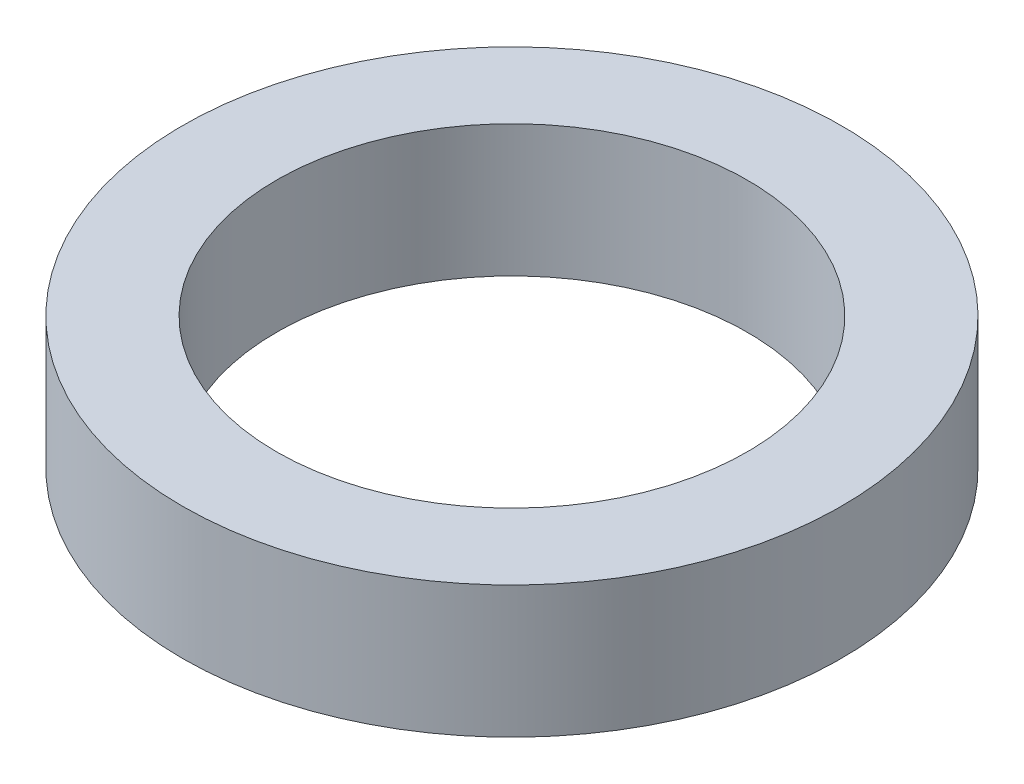
ISO-10303-21;
HEADER;
FILE_DESCRIPTION(('STEP AP214'),'2;1');
FILE_NAME('part.step','',(''),(''),'','','');
FILE_SCHEMA(('AUTOMOTIVE_DESIGN { 1 0 10303 214 1 1 1 1 }'));
ENDSEC;
DATA;
#1=APPLICATION_CONTEXT('core data for automotive mechanical design processes');
#2=APPLICATION_PROTOCOL_DEFINITION('international standard','automotive_design',2000,#1);
#3=PRODUCT_CONTEXT('',#1,'mechanical');
#4=PRODUCT('Part','Part','',(#3));
#5=PRODUCT_RELATED_PRODUCT_CATEGORY('part','',(#4));
#6=PRODUCT_DEFINITION_FORMATION('','',#4);
#7=PRODUCT_DEFINITION_CONTEXT('part definition',#1,'design');
#8=PRODUCT_DEFINITION('design','',#6,#7);
#9=PRODUCT_DEFINITION_SHAPE('','',#8);
#10=(LENGTH_UNIT() NAMED_UNIT(*) SI_UNIT(.MILLI.,.METRE.));
#11=(NAMED_UNIT(*) PLANE_ANGLE_UNIT() SI_UNIT($,.RADIAN.));
#12=(NAMED_UNIT(*) SI_UNIT($,.STERADIAN.) SOLID_ANGLE_UNIT());
#13=UNCERTAINTY_MEASURE_WITH_UNIT(LENGTH_MEASURE(1.E-05),#10,'distance_accuracy_value','');
#14=(GEOMETRIC_REPRESENTATION_CONTEXT(3) GLOBAL_UNCERTAINTY_ASSIGNED_CONTEXT((#13)) GLOBAL_UNIT_ASSIGNED_CONTEXT((#10,
#11,#12)) REPRESENTATION_CONTEXT('',''));
#15=CARTESIAN_POINT('',(0.,0.,0.));
#16=DIRECTION('',(0.,0.,1.));
#17=DIRECTION('',(1.,0.,0.));
#18=AXIS2_PLACEMENT_3D('',#15,#16,#17);
#19=CARTESIAN_POINT('',(0.,14.,0.));
#20=DIRECTION('',(0.,1.,0.));
#21=DIRECTION('',(0.,0.,1.));
#22=AXIS2_PLACEMENT_3D('',#19,#20,#21);
#23=PLANE('',#22);
#24=CARTESIAN_POINT('',(0.,14.,0.));
#25=DIRECTION('',(0.,1.,0.));
#26=DIRECTION('',(0.,0.,1.));
#27=AXIS2_PLACEMENT_3D('',#24,#25,#26);
#28=CIRCLE('',#27,35.);
#29=CARTESIAN_POINT('',(0.,14.,35.));
#30=VERTEX_POINT('',#29);
#31=EDGE_CURVE('E10',#30,#30,#28,.T.);
#32=ORIENTED_EDGE('',*,*,#31,.T.);
#33=EDGE_LOOP('',(#32));
#34=FACE_BOUND('',#33,.T.);
#35=CARTESIAN_POINT('',(0.,14.,0.));
#36=DIRECTION('',(0.,1.,0.));
#37=DIRECTION('',(0.,0.,1.));
#38=AXIS2_PLACEMENT_3D('',#35,#36,#37);
#39=CIRCLE('',#38,25.);
#40=CARTESIAN_POINT('',(0.,14.,25.));
#41=VERTEX_POINT('',#40);
#42=EDGE_CURVE('E54',#41,#41,#39,.T.);
#43=ORIENTED_EDGE('',*,*,#42,.F.);
#44=EDGE_LOOP('',(#43));
#45=FACE_BOUND('',#44,.T.);
#46=ADVANCED_FACE('F41',(#34,#45),#23,.T.);
#47=CARTESIAN_POINT('',(0.,0.,0.));
#48=DIRECTION('',(0.,1.,0.));
#49=DIRECTION('',(0.,0.,1.));
#50=AXIS2_PLACEMENT_3D('',#47,#48,#49);
#51=PLANE('',#50);
#52=CARTESIAN_POINT('',(0.,0.,0.));
#53=DIRECTION('',(0.,1.,0.));
#54=DIRECTION('',(0.,0.,1.));
#55=AXIS2_PLACEMENT_3D('',#52,#53,#54);
#56=CIRCLE('',#55,35.);
#57=CARTESIAN_POINT('',(0.,0.,35.));
#58=VERTEX_POINT('',#57);
#59=EDGE_CURVE('E45',#58,#58,#56,.T.);
#60=ORIENTED_EDGE('',*,*,#59,.F.);
#61=EDGE_LOOP('',(#60));
#62=FACE_BOUND('',#61,.T.);
#63=CARTESIAN_POINT('',(0.,0.,0.));
#64=DIRECTION('',(0.,1.,0.));
#65=DIRECTION('',(0.,0.,1.));
#66=AXIS2_PLACEMENT_3D('',#63,#64,#65);
#67=CIRCLE('',#66,25.);
#68=CARTESIAN_POINT('',(0.,0.,25.));
#69=VERTEX_POINT('',#68);
#70=EDGE_CURVE('E56',#69,#69,#67,.T.);
#71=ORIENTED_EDGE('',*,*,#70,.T.);
#72=EDGE_LOOP('',(#71));
#73=FACE_BOUND('',#72,.T.);
#74=ADVANCED_FACE('F68',(#62,#73),#51,.F.);
#75=CARTESIAN_POINT('',(0.,14.,0.));
#76=DIRECTION('',(0.,-1.,0.));
#77=DIRECTION('',(0.,0.,-1.));
#78=AXIS2_PLACEMENT_3D('',#75,#76,#77);
#79=CYLINDRICAL_SURFACE('',#78,35.);
#80=ORIENTED_EDGE('',*,*,#31,.F.);
#81=EDGE_LOOP('',(#80));
#82=FACE_BOUND('',#81,.T.);
#83=ORIENTED_EDGE('',*,*,#59,.T.);
#84=EDGE_LOOP('',(#83));
#85=FACE_BOUND('',#84,.T.);
#86=ADVANCED_FACE('F43',(#82,#85),#79,.T.);
#87=CARTESIAN_POINT('',(0.,14.,0.));
#88=DIRECTION('',(0.,-1.,0.));
#89=DIRECTION('',(0.,0.,-1.));
#90=AXIS2_PLACEMENT_3D('',#87,#88,#89);
#91=CYLINDRICAL_SURFACE('',#90,25.);
#92=ORIENTED_EDGE('',*,*,#42,.T.);
#93=EDGE_LOOP('',(#92));
#94=FACE_BOUND('',#93,.T.);
#95=ORIENTED_EDGE('',*,*,#70,.F.);
#96=EDGE_LOOP('',(#95));
#97=FACE_BOUND('',#96,.T.);
#98=ADVANCED_FACE('F64',(#94,#97),#91,.F.);
#99=CLOSED_SHELL('',(#46,#74,#86,#98));
#100=MANIFOLD_SOLID_BREP('B2',#99);
#101=ADVANCED_BREP_SHAPE_REPRESENTATION('',(#18,#100),#14);
#102=SHAPE_DEFINITION_REPRESENTATION(#9,#101);
ENDSEC;
END-ISO-10303-21;
